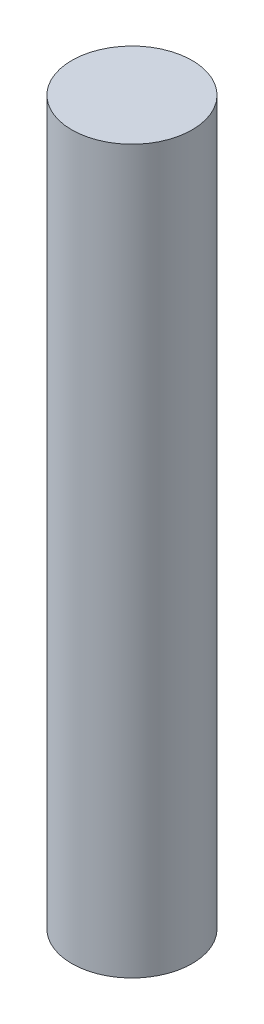
ISO-10303-21;
HEADER;
FILE_DESCRIPTION(('STEP AP214'),'2;1');
FILE_NAME('part.step','',(''),(''),'','','');
FILE_SCHEMA(('AUTOMOTIVE_DESIGN { 1 0 10303 214 1 1 1 1 }'));
ENDSEC;
DATA;
#1=APPLICATION_CONTEXT('core data for automotive mechanical design processes');
#2=APPLICATION_PROTOCOL_DEFINITION('international standard','automotive_design',2000,#1);
#3=PRODUCT_CONTEXT('',#1,'mechanical');
#4=PRODUCT('Part','Part','',(#3));
#5=PRODUCT_RELATED_PRODUCT_CATEGORY('part','',(#4));
#6=PRODUCT_DEFINITION_FORMATION('','',#4);
#7=PRODUCT_DEFINITION_CONTEXT('part definition',#1,'design');
#8=PRODUCT_DEFINITION('design','',#6,#7);
#9=PRODUCT_DEFINITION_SHAPE('','',#8);
#10=(LENGTH_UNIT() NAMED_UNIT(*) SI_UNIT(.MILLI.,.METRE.));
#11=(NAMED_UNIT(*) PLANE_ANGLE_UNIT() SI_UNIT($,.RADIAN.));
#12=(NAMED_UNIT(*) SI_UNIT($,.STERADIAN.) SOLID_ANGLE_UNIT());
#13=UNCERTAINTY_MEASURE_WITH_UNIT(LENGTH_MEASURE(1.E-05),#10,'distance_accuracy_value','');
#14=(GEOMETRIC_REPRESENTATION_CONTEXT(3) GLOBAL_UNCERTAINTY_ASSIGNED_CONTEXT((#13)) GLOBAL_UNIT_ASSIGNED_CONTEXT((#10,
#11,#12)) REPRESENTATION_CONTEXT('',''));
#15=CARTESIAN_POINT('',(0.,0.,0.));
#16=DIRECTION('',(0.,0.,1.));
#17=DIRECTION('',(1.,0.,0.));
#18=AXIS2_PLACEMENT_3D('',#15,#16,#17);
#19=CARTESIAN_POINT('',(-2.44791539592313,-30.,0.958023949275084));
#20=DIRECTION('',(0.,1.,0.));
#21=DIRECTION('',(0.,0.,1.));
#22=AXIS2_PLACEMENT_3D('',#19,#20,#21);
#23=CYLINDRICAL_SURFACE('',#22,2.5);
#24=CARTESIAN_POINT('',(-2.44791539592313,-30.,0.958023949275084));
#25=DIRECTION('',(0.,1.,0.));
#26=DIRECTION('',(0.,0.,1.));
#27=AXIS2_PLACEMENT_3D('',#24,#25,#26);
#28=CIRCLE('',#27,2.5);
#29=CARTESIAN_POINT('',(-2.44791539592313,-30.,3.45802394927508));
#30=VERTEX_POINT('',#29);
#31=EDGE_CURVE('E10',#30,#30,#28,.T.);
#32=ORIENTED_EDGE('',*,*,#31,.T.);
#33=EDGE_LOOP('',(#32));
#34=FACE_BOUND('',#33,.T.);
#35=CARTESIAN_POINT('',(-2.44791539592313,0.,0.958023949275084));
#36=DIRECTION('',(0.,1.,0.));
#37=DIRECTION('',(0.,0.,1.));
#38=AXIS2_PLACEMENT_3D('',#35,#36,#37);
#39=CIRCLE('',#38,2.5);
#40=CARTESIAN_POINT('',(-2.44791539592313,0.,3.45802394927508));
#41=VERTEX_POINT('',#40);
#42=EDGE_CURVE('E34',#41,#41,#39,.T.);
#43=ORIENTED_EDGE('',*,*,#42,.F.);
#44=EDGE_LOOP('',(#43));
#45=FACE_BOUND('',#44,.T.);
#46=ADVANCED_FACE('F31',(#34,#45),#23,.T.);
#47=CARTESIAN_POINT('',(-2.44791539592313,-30.,0.958023949275084));
#48=DIRECTION('',(0.,1.,0.));
#49=DIRECTION('',(0.,0.,1.));
#50=AXIS2_PLACEMENT_3D('',#47,#48,#49);
#51=PLANE('',#50);
#52=ORIENTED_EDGE('',*,*,#31,.F.);
#53=EDGE_LOOP('',(#52));
#54=FACE_BOUND('',#53,.T.);
#55=ADVANCED_FACE('F46',(#54),#51,.F.);
#56=CARTESIAN_POINT('',(-2.44791539592313,0.,0.958023949275084));
#57=DIRECTION('',(0.,1.,0.));
#58=DIRECTION('',(0.,0.,1.));
#59=AXIS2_PLACEMENT_3D('',#56,#57,#58);
#60=PLANE('',#59);
#61=ORIENTED_EDGE('',*,*,#42,.T.);
#62=EDGE_LOOP('',(#61));
#63=FACE_BOUND('',#62,.T.);
#64=ADVANCED_FACE('F43',(#63),#60,.T.);
#65=CLOSED_SHELL('',(#46,#55,#64));
#66=MANIFOLD_SOLID_BREP('B2',#65);
#67=ADVANCED_BREP_SHAPE_REPRESENTATION('',(#18,#66),#14);
#68=SHAPE_DEFINITION_REPRESENTATION(#9,#67);
ENDSEC;
END-ISO-10303-21;
